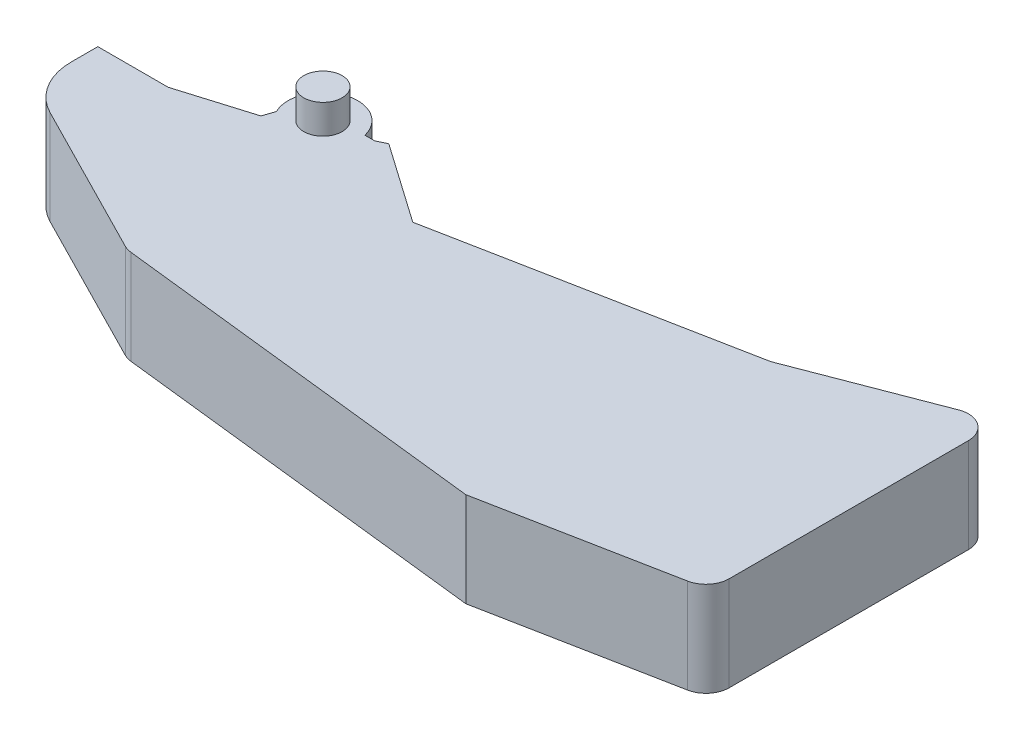
ISO-10303-21;
HEADER;
FILE_DESCRIPTION(('STEP AP214'),'2;1');
FILE_NAME('part.step','',(''),(''),'','','');
FILE_SCHEMA(('AUTOMOTIVE_DESIGN { 1 0 10303 214 1 1 1 1 }'));
ENDSEC;
DATA;
#1=APPLICATION_CONTEXT('core data for automotive mechanical design processes');
#2=APPLICATION_PROTOCOL_DEFINITION('international standard','automotive_design',2000,#1);
#3=PRODUCT_CONTEXT('',#1,'mechanical');
#4=PRODUCT('Part','Part','',(#3));
#5=PRODUCT_RELATED_PRODUCT_CATEGORY('part','',(#4));
#6=PRODUCT_DEFINITION_FORMATION('','',#4);
#7=PRODUCT_DEFINITION_CONTEXT('part definition',#1,'design');
#8=PRODUCT_DEFINITION('design','',#6,#7);
#9=PRODUCT_DEFINITION_SHAPE('','',#8);
#10=(LENGTH_UNIT() NAMED_UNIT(*) SI_UNIT(.MILLI.,.METRE.));
#11=(NAMED_UNIT(*) PLANE_ANGLE_UNIT() SI_UNIT($,.RADIAN.));
#12=(NAMED_UNIT(*) SI_UNIT($,.STERADIAN.) SOLID_ANGLE_UNIT());
#13=UNCERTAINTY_MEASURE_WITH_UNIT(LENGTH_MEASURE(1.E-05),#10,'distance_accuracy_value','');
#14=(GEOMETRIC_REPRESENTATION_CONTEXT(3) GLOBAL_UNCERTAINTY_ASSIGNED_CONTEXT((#13)) GLOBAL_UNIT_ASSIGNED_CONTEXT((#10,
#11,#12)) REPRESENTATION_CONTEXT('',''));
#15=CARTESIAN_POINT('',(0.,0.,0.));
#16=DIRECTION('',(0.,0.,1.));
#17=DIRECTION('',(1.,0.,0.));
#18=AXIS2_PLACEMENT_3D('',#15,#16,#17);
#19=CARTESIAN_POINT('',(43.8557588000729,-15.494,-32.9319911416841));
#20=DIRECTION('',(-0.358367949545299,0.,-0.933580426497202));
#21=DIRECTION('',(-0.933580426497202,0.,0.358367949545299));
#22=AXIS2_PLACEMENT_3D('',#19,#20,#21);
#23=PLANE('',#22);
#24=DIRECTION('',(0.,1.,0.));
#25=VECTOR('',#24,1.);
#26=CARTESIAN_POINT('',(52.4040091818142,-15.494,-36.2133570257123));
#27=LINE('',#26,#25);
#28=CARTESIAN_POINT('',(52.4040091818142,0.,-36.2133570257123));
#29=VERTEX_POINT('',#28);
#30=CARTESIAN_POINT('',(52.4040091818142,-15.494,-36.2133570257123));
#31=VERTEX_POINT('',#30);
#32=EDGE_CURVE('E473',#29,#31,#27,.F.);
#33=ORIENTED_EDGE('',*,*,#32,.T.);
#34=DIRECTION('',(-0.933580426497202,0.,0.3583679495453));
#35=VECTOR('',#34,1.);
#36=CARTESIAN_POINT('',(43.8557588000729,-15.494,-32.9319911416841));
#37=LINE('',#36,#35);
#38=CARTESIAN_POINT('',(30.1321265305642,-15.494,-27.6639822833682));
#39=VERTEX_POINT('',#38);
#40=EDGE_CURVE('E470',#31,#39,#37,.T.);
#41=ORIENTED_EDGE('',*,*,#40,.T.);
#42=DIRECTION('',(0.,1.,0.));
#43=VECTOR('',#42,1.);
#44=CARTESIAN_POINT('',(30.1321265305642,-15.494,-27.6639822833682));
#45=LINE('',#44,#43);
#46=CARTESIAN_POINT('',(30.1321265305642,0.,-27.6639822833682));
#47=VERTEX_POINT('',#46);
#48=EDGE_CURVE('E467',#39,#47,#45,.T.);
#49=ORIENTED_EDGE('',*,*,#48,.T.);
#50=DIRECTION('',(-0.933580426497202,0.,0.3583679495453));
#51=VECTOR('',#50,1.);
#52=CARTESIAN_POINT('',(43.8557588000729,0.,-32.9319911416841));
#53=LINE('',#52,#51);
#54=EDGE_CURVE('E463',#29,#47,#53,.T.);
#55=ORIENTED_EDGE('',*,*,#54,.F.);
#56=EDGE_LOOP('',(#33,#41,#49,#55));
#57=FACE_BOUND('',#56,.T.);
#58=ADVANCED_FACE('F53',(#57),#23,.T.);
#59=CARTESIAN_POINT('',(57.5793910695818,-15.494,-19.1));
#60=DIRECTION('',(1.,0.,0.));
#61=DIRECTION('',(0.,0.,-1.));
#62=AXIS2_PLACEMENT_3D('',#59,#60,#61);
#63=PLANE('',#62);
#64=DIRECTION('',(0.,1.,0.));
#65=VECTOR('',#64,1.);
#66=CARTESIAN_POINT('',(57.5793910695818,-15.494,6.58405752319649));
#67=LINE('',#66,#65);
#68=CARTESIAN_POINT('',(57.5793910695818,0.,6.58405752319649));
#69=VERTEX_POINT('',#68);
#70=CARTESIAN_POINT('',(57.5793910695818,-15.494,6.58405752319649));
#71=VERTEX_POINT('',#70);
#72=EDGE_CURVE('E460',#69,#71,#67,.F.);
#73=ORIENTED_EDGE('',*,*,#72,.T.);
#74=DIRECTION('',(0.,0.,-1.));
#75=VECTOR('',#74,1.);
#76=CARTESIAN_POINT('',(57.5793910695818,-15.494,-19.1));
#77=LINE('',#76,#75);
#78=CARTESIAN_POINT('',(57.5793910695818,-15.494,-32.656415600758));
#79=VERTEX_POINT('',#78);
#80=EDGE_CURVE('E457',#71,#79,#77,.T.);
#81=ORIENTED_EDGE('',*,*,#80,.T.);
#82=DIRECTION('',(0.,1.,0.));
#83=VECTOR('',#82,1.);
#84=CARTESIAN_POINT('',(57.5793910695818,-15.494,-32.656415600758));
#85=LINE('',#84,#83);
#86=CARTESIAN_POINT('',(57.5793910695818,0.,-32.656415600758));
#87=VERTEX_POINT('',#86);
#88=EDGE_CURVE('E454',#79,#87,#85,.T.);
#89=ORIENTED_EDGE('',*,*,#88,.T.);
#90=DIRECTION('',(0.,0.,-1.));
#91=VECTOR('',#90,1.);
#92=CARTESIAN_POINT('',(57.5793910695818,0.,-19.1));
#93=LINE('',#92,#91);
#94=EDGE_CURVE('E450',#69,#87,#93,.T.);
#95=ORIENTED_EDGE('',*,*,#94,.F.);
#96=EDGE_LOOP('',(#73,#81,#89,#95));
#97=FACE_BOUND('',#96,.T.);
#98=ADVANCED_FACE('F530',(#97),#63,.T.);
#99=CARTESIAN_POINT('',(40.809422082398,-15.494,12.9845309091199));
#100=DIRECTION('',(0.190808995376544,0.,0.981627183447664));
#101=DIRECTION('',(0.981627183447664,0.,-0.190808995376544));
#102=AXIS2_PLACEMENT_3D('',#99,#100,#101);
#103=PLANE('',#102);
#104=DIRECTION('',(0.,1.,0.));
#105=VECTOR('',#104,1.);
#106=CARTESIAN_POINT('',(24.0394530952143,-15.494,16.2442826650786));
#107=LINE('',#106,#105);
#108=CARTESIAN_POINT('',(24.0394530952143,-15.494,16.2442826650786));
#109=VERTEX_POINT('',#108);
#110=CARTESIAN_POINT('',(24.0394530952143,0.,16.2442826650786));
#111=VERTEX_POINT('',#110);
#112=EDGE_CURVE('E446',#109,#111,#107,.T.);
#113=ORIENTED_EDGE('',*,*,#112,.F.);
#114=DIRECTION('',(0.981627183447664,0.,-0.190808995376544));
#115=VECTOR('',#114,1.);
#116=CARTESIAN_POINT('',(40.809422082398,-15.494,12.9845309091199));
#117=LINE('',#116,#115);
#118=CARTESIAN_POINT('',(54.4963733419664,-15.494,10.3240570921321));
#119=VERTEX_POINT('',#118);
#120=EDGE_CURVE('E443',#109,#119,#117,.T.);
#121=ORIENTED_EDGE('',*,*,#120,.T.);
#122=DIRECTION('',(0.,1.,0.));
#123=VECTOR('',#122,1.);
#124=CARTESIAN_POINT('',(54.4963733419664,-15.494,10.3240570921321));
#125=LINE('',#124,#123);
#126=CARTESIAN_POINT('',(54.4963733419664,0.,10.3240570921321));
#127=VERTEX_POINT('',#126);
#128=EDGE_CURVE('E440',#119,#127,#125,.T.);
#129=ORIENTED_EDGE('',*,*,#128,.T.);
#130=DIRECTION('',(0.981627183447664,0.,-0.190808995376544));
#131=VECTOR('',#130,1.);
#132=CARTESIAN_POINT('',(40.809422082398,0.,12.9845309091199));
#133=LINE('',#132,#131);
#134=EDGE_CURVE('E436',#111,#127,#133,.T.);
#135=ORIENTED_EDGE('',*,*,#134,.F.);
#136=EDGE_LOOP('',(#113,#121,#129,#135));
#137=FACE_BOUND('',#136,.T.);
#138=ADVANCED_FACE('F535',(#137),#103,.T.);
#139=CARTESIAN_POINT('',(-23.0988407655279,-15.494,10.9390331126197));
#140=DIRECTION('',(-0.111840394594806,0.,0.993726182676535));
#141=DIRECTION('',(0.993726182676535,0.,0.111840394594806));
#142=AXIS2_PLACEMENT_3D('',#139,#140,#141);
#143=PLANE('',#142);
#144=DIRECTION('',(0.,1.,0.));
#145=VECTOR('',#144,1.);
#146=CARTESIAN_POINT('',(-37.8654554184542,-15.494,9.27710245364836));
#147=LINE('',#146,#145);
#148=CARTESIAN_POINT('',(-37.8654554184542,0.,9.27710245364836));
#149=VERTEX_POINT('',#148);
#150=CARTESIAN_POINT('',(-37.8654554184542,-15.494,9.27710245364836));
#151=VERTEX_POINT('',#150);
#152=EDGE_CURVE('E433',#149,#151,#147,.F.);
#153=ORIENTED_EDGE('',*,*,#152,.T.);
#154=DIRECTION('',(0.993726182676535,0.,0.111840394594806));
#155=VECTOR('',#154,1.);
#156=CARTESIAN_POINT('',(-23.0988407655279,-15.494,10.9390331126197));
#157=LINE('',#156,#155);
#158=EDGE_CURVE('E429',#151,#109,#157,.T.);
#159=ORIENTED_EDGE('',*,*,#158,.T.);
#160=ORIENTED_EDGE('',*,*,#112,.T.);
#161=DIRECTION('',(0.993726182676535,0.,0.111840394594806));
#162=VECTOR('',#161,1.);
#163=CARTESIAN_POINT('',(-23.0988407655279,0.,10.9390331126197));
#164=LINE('',#163,#162);
#165=EDGE_CURVE('E425',#149,#111,#164,.T.);
#166=ORIENTED_EDGE('',*,*,#165,.F.);
#167=EDGE_LOOP('',(#153,#159,#160,#166));
#168=FACE_BOUND('',#167,.T.);
#169=ADVANCED_FACE('F541',(#168),#143,.T.);
#170=CARTESIAN_POINT('',(-54.1689812200517,-15.494,1.24289249151677));
#171=DIRECTION('',(-0.453990499739547,0.,0.891006524188368));
#172=DIRECTION('',(0.891006524188368,0.,0.453990499739547));
#173=AXIS2_PLACEMENT_3D('',#170,#171,#172);
#174=PLANE('',#173);
#175=DIRECTION('',(0.891006524188368,0.,0.453990499739547));
#176=VECTOR('',#175,1.);
#177=CARTESIAN_POINT('',(-54.1689812200517,0.,1.24289249151677));
#178=LINE('',#177,#176);
#179=CARTESIAN_POINT('',(-64.3250925925634,0.,-3.93190472067773));
#180=VERTEX_POINT('',#179);
#181=CARTESIAN_POINT('',(-39.1690473190557,0.,8.88574055480845));
#182=VERTEX_POINT('',#181);
#183=EDGE_CURVE('E415',#180,#182,#178,.T.);
#184=ORIENTED_EDGE('',*,*,#183,.F.);
#185=DIRECTION('',(0.,1.,0.));
#186=VECTOR('',#185,1.);
#187=CARTESIAN_POINT('',(-64.3250925925634,-15.494,-3.93190472067773));
#188=LINE('',#187,#186);
#189=CARTESIAN_POINT('',(-64.3250925925634,-15.494,-3.93190472067773));
#190=VERTEX_POINT('',#189);
#191=EDGE_CURVE('E62',#180,#190,#188,.F.);
#192=ORIENTED_EDGE('',*,*,#191,.T.);
#193=DIRECTION('',(0.891006524188368,0.,0.453990499739547));
#194=VECTOR('',#193,1.);
#195=CARTESIAN_POINT('',(-54.1689812200517,-15.494,1.24289249151677));
#196=LINE('',#195,#194);
#197=CARTESIAN_POINT('',(-39.1690473190557,-15.494,8.88574055480845));
#198=VERTEX_POINT('',#197);
#199=EDGE_CURVE('E422',#190,#198,#196,.T.);
#200=ORIENTED_EDGE('',*,*,#199,.T.);
#201=DIRECTION('',(0.,1.,0.));
#202=VECTOR('',#201,1.);
#203=CARTESIAN_POINT('',(-39.1690473190557,-15.494,8.88574055480845));
#204=LINE('',#203,#202);
#205=EDGE_CURVE('E418',#198,#182,#204,.T.);
#206=ORIENTED_EDGE('',*,*,#205,.T.);
#207=EDGE_LOOP('',(#184,#192,#200,#206));
#208=FACE_BOUND('',#207,.T.);
#209=ADVANCED_FACE('F545',(#208),#174,.T.);
#210=CARTESIAN_POINT('',(-69.7851875951679,-15.494,-11.9671071016602));
#211=DIRECTION('',(-1.,0.,0.));
#212=DIRECTION('',(0.,0.,1.));
#213=AXIS2_PLACEMENT_3D('',#210,#211,#212);
#214=PLANE('',#213);
#215=DIRECTION('',(0.,0.,1.));
#216=VECTOR('',#215,1.);
#217=CARTESIAN_POINT('',(-69.7851875951679,-15.494,-11.9671071016602));
#218=LINE('',#217,#216);
#219=CARTESIAN_POINT('',(-69.7851875951679,-15.494,-17.2202521221583));
#220=VERTEX_POINT('',#219);
#221=CARTESIAN_POINT('',(-69.7851875951679,-15.494,-12.8419699625614));
#222=VERTEX_POINT('',#221);
#223=EDGE_CURVE('E407',#220,#222,#218,.T.);
#224=ORIENTED_EDGE('',*,*,#223,.T.);
#225=DIRECTION('',(0.,1.,0.));
#226=VECTOR('',#225,1.);
#227=CARTESIAN_POINT('',(-69.7851875951679,-15.494,-12.8419699625614));
#228=LINE('',#227,#226);
#229=CARTESIAN_POINT('',(-69.7851875951679,0.,-12.8419699625614));
#230=VERTEX_POINT('',#229);
#231=EDGE_CURVE('E476',#222,#230,#228,.T.);
#232=ORIENTED_EDGE('',*,*,#231,.T.);
#233=DIRECTION('',(0.,0.,1.));
#234=VECTOR('',#233,1.);
#235=CARTESIAN_POINT('',(-69.7851875951679,0.,-11.9671071016602));
#236=LINE('',#235,#234);
#237=CARTESIAN_POINT('',(-69.7851875951679,0.,-17.2202521221583));
#238=VERTEX_POINT('',#237);
#239=EDGE_CURVE('E404',#238,#230,#236,.T.);
#240=ORIENTED_EDGE('',*,*,#239,.F.);
#241=DIRECTION('',(0.,1.,0.));
#242=VECTOR('',#241,1.);
#243=CARTESIAN_POINT('',(-69.7851875951679,-15.494,-17.2202521221583));
#244=LINE('',#243,#242);
#245=CARTESIAN_POINT('',(-69.7851875951679,-2.4137702714423,-17.2202521221583));
#246=VERTEX_POINT('',#245);
#247=EDGE_CURVE('E403',#246,#238,#244,.T.);
#248=ORIENTED_EDGE('',*,*,#247,.F.);
#249=DIRECTION('',(0.,0.,-1.));
#250=VECTOR('',#249,1.);
#251=CARTESIAN_POINT('',(-69.7851875951679,-2.4137702714423,-11.9671071016602));
#252=LINE('',#251,#250);
#253=CARTESIAN_POINT('',(-69.7851875951679,-2.4137702714423,-16.2042521221583));
#254=VERTEX_POINT('',#253);
#255=EDGE_CURVE('E399',#254,#246,#252,.T.);
#256=ORIENTED_EDGE('',*,*,#255,.F.);
#257=DIRECTION('',(0.,-1.,0.));
#258=VECTOR('',#257,1.);
#259=CARTESIAN_POINT('',(-69.7851875951679,-15.494,-16.2042521221583));
#260=LINE('',#259,#258);
#261=CARTESIAN_POINT('',(-69.7851875951679,-12.8277702714423,-16.2042521221583));
#262=VERTEX_POINT('',#261);
#263=EDGE_CURVE('E396',#254,#262,#260,.T.);
#264=ORIENTED_EDGE('',*,*,#263,.T.);
#265=DIRECTION('',(0.,0.,1.));
#266=VECTOR('',#265,1.);
#267=CARTESIAN_POINT('',(-69.7851875951679,-12.8277702714423,-11.9671071016602));
#268=LINE('',#267,#266);
#269=CARTESIAN_POINT('',(-69.7851875951679,-12.8277702714423,-17.2202521221583));
#270=VERTEX_POINT('',#269);
#271=EDGE_CURVE('E393',#270,#262,#268,.T.);
#272=ORIENTED_EDGE('',*,*,#271,.F.);
#273=EDGE_CURVE('E411',#220,#270,#244,.T.);
#274=ORIENTED_EDGE('',*,*,#273,.F.);
#275=EDGE_LOOP('',(#224,#232,#240,#248,#256,#264,#272,#274));
#276=FACE_BOUND('',#275,.T.);
#277=ADVANCED_FACE('F497',(#276),#214,.T.);
#278=CARTESIAN_POINT('',(-40.8221068625392,-15.494,-25.1820473738689));
#279=DIRECTION('',(0.,1.,0.));
#280=DIRECTION('',(0.,0.,1.));
#281=AXIS2_PLACEMENT_3D('',#278,#279,#280);
#282=CYLINDRICAL_SURFACE('',#281,5.69049014174114);
#283=CARTESIAN_POINT('',(-40.8221068625392,-15.494,-25.1820473738689));
#284=DIRECTION('',(0.,-1.,0.));
#285=DIRECTION('',(0.,0.,-1.));
#286=AXIS2_PLACEMENT_3D('',#283,#284,#285);
#287=CIRCLE('',#286,5.69049014174114);
#288=CARTESIAN_POINT('',(-45.9175512473654,-15.494,-22.6486455947593));
#289=VERTEX_POINT('',#288);
#290=CARTESIAN_POINT('',(-35.2972195374979,-15.494,-26.5448746185521));
#291=VERTEX_POINT('',#290);
#292=EDGE_CURVE('E389',#289,#291,#287,.T.);
#293=ORIENTED_EDGE('',*,*,#292,.F.);
#294=DIRECTION('',(0.,1.,0.));
#295=VECTOR('',#294,1.);
#296=CARTESIAN_POINT('',(-45.9175512473654,-15.494,-22.6486455947593));
#297=LINE('',#296,#295);
#298=CARTESIAN_POINT('',(-45.9175512473654,0.,-22.6486455947593));
#299=VERTEX_POINT('',#298);
#300=EDGE_CURVE('E386',#289,#299,#297,.T.);
#301=ORIENTED_EDGE('',*,*,#300,.T.);
#302=CARTESIAN_POINT('',(-40.8221068625392,0.,-25.1820473738689));
#303=DIRECTION('',(0.,-1.,0.));
#304=DIRECTION('',(0.,0.,-1.));
#305=AXIS2_PLACEMENT_3D('',#302,#303,#304);
#306=CIRCLE('',#305,5.69049014174114);
#307=CARTESIAN_POINT('',(-35.2972195374979,0.,-26.5448746185521));
#308=VERTEX_POINT('',#307);
#309=EDGE_CURVE('E383',#299,#308,#306,.T.);
#310=ORIENTED_EDGE('',*,*,#309,.T.);
#311=DIRECTION('',(0.,1.,0.));
#312=VECTOR('',#311,1.);
#313=CARTESIAN_POINT('',(-35.2972195374979,-15.494,-26.5448746185521));
#314=LINE('',#313,#312);
#315=EDGE_CURVE('E379',#291,#308,#314,.T.);
#316=ORIENTED_EDGE('',*,*,#315,.F.);
#317=EDGE_LOOP('',(#293,#301,#310,#316));
#318=FACE_BOUND('',#317,.T.);
#319=ADVANCED_FACE('F551',(#318),#282,.T.);
#320=CARTESIAN_POINT('',(-37.4393435150481,-15.494,5.49100569765077));
#321=DIRECTION('',(0.,1.,0.));
#322=DIRECTION('',(0.,0.,1.));
#323=AXIS2_PLACEMENT_3D('',#320,#321,#322);
#324=CYLINDRICAL_SURFACE('',#323,3.81);
#325=ORIENTED_EDGE('',*,*,#205,.F.);
#326=CARTESIAN_POINT('',(-37.4393435150481,-15.494,5.49100569765077));
#327=DIRECTION('',(0.,-1.,0.));
#328=DIRECTION('',(0.,0.,-1.));
#329=AXIS2_PLACEMENT_3D('',#326,#327,#328);
#330=CIRCLE('',#329,3.81);
#331=EDGE_CURVE('E375',#198,#151,#330,.F.);
#332=ORIENTED_EDGE('',*,*,#331,.T.);
#333=ORIENTED_EDGE('',*,*,#152,.F.);
#334=CARTESIAN_POINT('',(-37.4393435150481,0.,5.49100569765077));
#335=DIRECTION('',(0.,-1.,0.));
#336=DIRECTION('',(0.,0.,-1.));
#337=AXIS2_PLACEMENT_3D('',#334,#335,#336);
#338=CIRCLE('',#337,3.81);
#339=EDGE_CURVE('E371',#182,#149,#338,.F.);
#340=ORIENTED_EDGE('',*,*,#339,.F.);
#341=EDGE_LOOP('',(#325,#332,#333,#340));
#342=FACE_BOUND('',#341,.T.);
#343=ADVANCED_FACE('F554',(#342),#324,.T.);
#344=CARTESIAN_POINT('',(53.7693910695818,-15.494,6.58405752319649));
#345=DIRECTION('',(0.,1.,0.));
#346=DIRECTION('',(0.,0.,1.));
#347=AXIS2_PLACEMENT_3D('',#344,#345,#346);
#348=CYLINDRICAL_SURFACE('',#347,3.81);
#349=ORIENTED_EDGE('',*,*,#128,.F.);
#350=CARTESIAN_POINT('',(53.7693910695818,-15.494,6.58405752319649));
#351=DIRECTION('',(0.,-1.,0.));
#352=DIRECTION('',(0.,0.,-1.));
#353=AXIS2_PLACEMENT_3D('',#350,#351,#352);
#354=CIRCLE('',#353,3.81);
#355=EDGE_CURVE('E367',#119,#71,#354,.F.);
#356=ORIENTED_EDGE('',*,*,#355,.T.);
#357=ORIENTED_EDGE('',*,*,#72,.F.);
#358=CARTESIAN_POINT('',(53.7693910695818,0.,6.58405752319649));
#359=DIRECTION('',(0.,-1.,0.));
#360=DIRECTION('',(0.,0.,-1.));
#361=AXIS2_PLACEMENT_3D('',#358,#359,#360);
#362=CIRCLE('',#361,3.81);
#363=EDGE_CURVE('E363',#127,#69,#362,.F.);
#364=ORIENTED_EDGE('',*,*,#363,.F.);
#365=EDGE_LOOP('',(#349,#356,#357,#364));
#366=FACE_BOUND('',#365,.T.);
#367=ADVANCED_FACE('F558',(#366),#348,.T.);
#368=CARTESIAN_POINT('',(53.7693910695818,-15.494,-32.656415600758));
#369=DIRECTION('',(0.,1.,0.));
#370=DIRECTION('',(0.,0.,1.));
#371=AXIS2_PLACEMENT_3D('',#368,#369,#370);
#372=CYLINDRICAL_SURFACE('',#371,3.81);
#373=ORIENTED_EDGE('',*,*,#88,.F.);
#374=CARTESIAN_POINT('',(53.7693910695818,-15.494,-32.656415600758));
#375=DIRECTION('',(0.,-1.,0.));
#376=DIRECTION('',(0.,0.,-1.));
#377=AXIS2_PLACEMENT_3D('',#374,#375,#376);
#378=CIRCLE('',#377,3.81);
#379=EDGE_CURVE('E359',#79,#31,#378,.F.);
#380=ORIENTED_EDGE('',*,*,#379,.T.);
#381=ORIENTED_EDGE('',*,*,#32,.F.);
#382=CARTESIAN_POINT('',(53.7693910695818,0.,-32.656415600758));
#383=DIRECTION('',(0.,-1.,0.));
#384=DIRECTION('',(0.,0.,-1.));
#385=AXIS2_PLACEMENT_3D('',#382,#383,#384);
#386=CIRCLE('',#385,3.81);
#387=EDGE_CURVE('E355',#87,#29,#386,.F.);
#388=ORIENTED_EDGE('',*,*,#387,.F.);
#389=EDGE_LOOP('',(#373,#380,#381,#388));
#390=FACE_BOUND('',#389,.T.);
#391=ADVANCED_FACE('F562',(#390),#372,.T.);
#392=CARTESIAN_POINT('',(-61.2424166205108,-15.494,-17.2202521221583));
#393=DIRECTION('',(0.,0.,1.));
#394=DIRECTION('',(1.,0.,0.));
#395=AXIS2_PLACEMENT_3D('',#392,#393,#394);
#396=PLANE('',#395);
#397=DIRECTION('',(0.,1.,0.));
#398=VECTOR('',#397,1.);
#399=CARTESIAN_POINT('',(-58.2424166205108,-15.494,-17.2202521221583));
#400=LINE('',#399,#398);
#401=CARTESIAN_POINT('',(-58.2424166205108,-15.494,-17.2202521221583));
#402=VERTEX_POINT('',#401);
#403=CARTESIAN_POINT('',(-58.2424166205108,0.,-17.2202521221583));
#404=VERTEX_POINT('',#403);
#405=EDGE_CURVE('E351',#402,#404,#400,.T.);
#406=ORIENTED_EDGE('',*,*,#405,.F.);
#407=DIRECTION('',(1.,0.,0.));
#408=VECTOR('',#407,1.);
#409=CARTESIAN_POINT('',(-61.2424166205108,-15.494,-17.2202521221583));
#410=LINE('',#409,#408);
#411=EDGE_CURVE('E347',#220,#402,#410,.T.);
#412=ORIENTED_EDGE('',*,*,#411,.F.);
#413=ORIENTED_EDGE('',*,*,#273,.T.);
#414=DIRECTION('',(-1.,0.,0.));
#415=VECTOR('',#414,1.);
#416=CARTESIAN_POINT('',(-67.6658166205107,-12.8277702714423,-17.2202521221583));
#417=LINE('',#416,#415);
#418=CARTESIAN_POINT('',(-61.6714166205108,-12.8277702714423,-17.2202521221583));
#419=VERTEX_POINT('',#418);
#420=EDGE_CURVE('E343',#419,#270,#417,.T.);
#421=ORIENTED_EDGE('',*,*,#420,.F.);
#422=DIRECTION('',(0.,1.,0.));
#423=VECTOR('',#422,1.);
#424=CARTESIAN_POINT('',(-61.6714166205108,-7.6207702714423,-17.2202521221583));
#425=LINE('',#424,#423);
#426=CARTESIAN_POINT('',(-61.6714166205108,-2.4137702714423,-17.2202521221583));
#427=VERTEX_POINT('',#426);
#428=EDGE_CURVE('E340',#419,#427,#425,.T.);
#429=ORIENTED_EDGE('',*,*,#428,.T.);
#430=DIRECTION('',(1.,0.,0.));
#431=VECTOR('',#430,1.);
#432=CARTESIAN_POINT('',(-67.6658166205107,-2.4137702714423,-17.2202521221583));
#433=LINE('',#432,#431);
#434=EDGE_CURVE('E336',#246,#427,#433,.T.);
#435=ORIENTED_EDGE('',*,*,#434,.F.);
#436=ORIENTED_EDGE('',*,*,#247,.T.);
#437=DIRECTION('',(1.,0.,0.));
#438=VECTOR('',#437,1.);
#439=CARTESIAN_POINT('',(-61.2424166205108,0.,-17.2202521221583));
#440=LINE('',#439,#438);
#441=EDGE_CURVE('E333',#238,#404,#440,.T.);
#442=ORIENTED_EDGE('',*,*,#441,.T.);
#443=EDGE_LOOP('',(#406,#412,#413,#421,#429,#435,#436,#442));
#444=FACE_BOUND('',#443,.T.);
#445=ADVANCED_FACE('F486',(#444),#396,.F.);
#446=CARTESIAN_POINT('',(-53.2601353905734,-15.494,-18.7265385311171));
#447=DIRECTION('',(0.289392201529061,0.,0.957210610938974));
#448=DIRECTION('',(0.957210610938974,0.,-0.289392201529061));
#449=AXIS2_PLACEMENT_3D('',#446,#447,#448);
#450=PLANE('',#449);
#451=DIRECTION('',(0.,1.,0.));
#452=VECTOR('',#451,1.);
#453=CARTESIAN_POINT('',(-46.5661832017515,-15.494,-20.7503121277691));
#454=LINE('',#453,#452);
#455=CARTESIAN_POINT('',(-46.5661832017515,-15.494,-20.7503121277691));
#456=VERTEX_POINT('',#455);
#457=CARTESIAN_POINT('',(-46.5661832017515,0.,-20.7503121277691));
#458=VERTEX_POINT('',#457);
#459=EDGE_CURVE('E329',#456,#458,#454,.T.);
#460=ORIENTED_EDGE('',*,*,#459,.F.);
#461=DIRECTION('',(0.957210610938974,0.,-0.289392201529061));
#462=VECTOR('',#461,1.);
#463=CARTESIAN_POINT('',(-53.2601353905734,-15.494,-18.7265385311171));
#464=LINE('',#463,#462);
#465=EDGE_CURVE('E325',#402,#456,#464,.T.);
#466=ORIENTED_EDGE('',*,*,#465,.F.);
#467=ORIENTED_EDGE('',*,*,#405,.T.);
#468=DIRECTION('',(0.957210610938974,0.,-0.289392201529061));
#469=VECTOR('',#468,1.);
#470=CARTESIAN_POINT('',(-53.2601353905734,0.,-18.7265385311171));
#471=LINE('',#470,#469);
#472=EDGE_CURVE('E322',#404,#458,#471,.T.);
#473=ORIENTED_EDGE('',*,*,#472,.T.);
#474=EDGE_LOOP('',(#460,#466,#467,#473));
#475=FACE_BOUND('',#474,.T.);
#476=ADVANCED_FACE('F504',(#475),#450,.F.);
#477=CARTESIAN_POINT('',(-46.2418672245585,-15.494,-21.6994788612642));
#478=DIRECTION('',(0.946285732592842,0.,0.323331582576196));
#479=DIRECTION('',(0.323331582576196,0.,-0.946285732592842));
#480=AXIS2_PLACEMENT_3D('',#477,#478,#479);
#481=PLANE('',#480);
#482=ORIENTED_EDGE('',*,*,#300,.F.);
#483=DIRECTION('',(0.323331582576197,0.,-0.946285732592842));
#484=VECTOR('',#483,1.);
#485=CARTESIAN_POINT('',(-46.2418672245585,-15.494,-21.6994788612642));
#486=LINE('',#485,#484);
#487=EDGE_CURVE('E318',#456,#289,#486,.T.);
#488=ORIENTED_EDGE('',*,*,#487,.F.);
#489=ORIENTED_EDGE('',*,*,#459,.T.);
#490=DIRECTION('',(0.323331582576197,0.,-0.946285732592842));
#491=VECTOR('',#490,1.);
#492=CARTESIAN_POINT('',(-46.2418672245585,0.,-21.6994788612642));
#493=LINE('',#492,#491);
#494=EDGE_CURVE('E314',#458,#299,#493,.T.);
#495=ORIENTED_EDGE('',*,*,#494,.T.);
#496=EDGE_LOOP('',(#482,#488,#489,#495));
#497=FACE_BOUND('',#496,.T.);
#498=ADVANCED_FACE('F509',(#497),#481,.F.);
#499=CARTESIAN_POINT('',(-34.4967503403147,-15.494,-26.5448746185521));
#500=DIRECTION('',(0.,0.,-1.));
#501=DIRECTION('',(-1.,0.,0.));
#502=AXIS2_PLACEMENT_3D('',#499,#500,#501);
#503=PLANE('',#502);
#504=DIRECTION('',(-1.,0.,0.));
#505=VECTOR('',#504,1.);
#506=CARTESIAN_POINT('',(-34.4967503403147,-15.494,-26.5448746185521));
#507=LINE('',#506,#505);
#508=CARTESIAN_POINT('',(-33.6962811431316,-15.494,-26.5448746185521));
#509=VERTEX_POINT('',#508);
#510=EDGE_CURVE('E310',#509,#291,#507,.T.);
#511=ORIENTED_EDGE('',*,*,#510,.T.);
#512=ORIENTED_EDGE('',*,*,#315,.T.);
#513=DIRECTION('',(-1.,0.,0.));
#514=VECTOR('',#513,1.);
#515=CARTESIAN_POINT('',(-34.4967503403147,0.,-26.5448746185521));
#516=LINE('',#515,#514);
#517=CARTESIAN_POINT('',(-33.6962811431316,0.,-26.5448746185521));
#518=VERTEX_POINT('',#517);
#519=EDGE_CURVE('E306',#518,#308,#516,.T.);
#520=ORIENTED_EDGE('',*,*,#519,.F.);
#521=DIRECTION('',(0.,1.,0.));
#522=VECTOR('',#521,1.);
#523=CARTESIAN_POINT('',(-33.6962811431316,-15.494,-26.5448746185521));
#524=LINE('',#523,#522);
#525=EDGE_CURVE('E302',#509,#518,#524,.T.);
#526=ORIENTED_EDGE('',*,*,#525,.F.);
#527=EDGE_LOOP('',(#511,#512,#520,#526));
#528=FACE_BOUND('',#527,.T.);
#529=ADVANCED_FACE('F573',(#528),#503,.T.);
#530=CARTESIAN_POINT('',(-32.910330198208,-15.494,-26.9161367425167));
#531=DIRECTION('',(-0.427117887924654,0.,-0.904195946581703));
#532=DIRECTION('',(-0.904195946581703,0.,0.427117887924654));
#533=AXIS2_PLACEMENT_3D('',#530,#531,#532);
#534=PLANE('',#533);
#535=DIRECTION('',(-0.904195946581703,0.,0.427117887924655));
#536=VECTOR('',#535,1.);
#537=CARTESIAN_POINT('',(-32.910330198208,-15.494,-26.9161367425167));
#538=LINE('',#537,#536);
#539=CARTESIAN_POINT('',(-32.1243792532844,-15.494,-27.2873988664814));
#540=VERTEX_POINT('',#539);
#541=EDGE_CURVE('E298',#540,#509,#538,.T.);
#542=ORIENTED_EDGE('',*,*,#541,.T.);
#543=ORIENTED_EDGE('',*,*,#525,.T.);
#544=DIRECTION('',(-0.904195946581703,0.,0.427117887924655));
#545=VECTOR('',#544,1.);
#546=CARTESIAN_POINT('',(-32.910330198208,0.,-26.9161367425167));
#547=LINE('',#546,#545);
#548=CARTESIAN_POINT('',(-32.1243792532844,0.,-27.2873988664814));
#549=VERTEX_POINT('',#548);
#550=EDGE_CURVE('E294',#549,#518,#547,.T.);
#551=ORIENTED_EDGE('',*,*,#550,.F.);
#552=DIRECTION('',(0.,1.,0.));
#553=VECTOR('',#552,1.);
#554=CARTESIAN_POINT('',(-32.1243792532844,-15.494,-27.2873988664814));
#555=LINE('',#554,#553);
#556=EDGE_CURVE('E290',#540,#549,#555,.T.);
#557=ORIENTED_EDGE('',*,*,#556,.F.);
#558=EDGE_LOOP('',(#542,#543,#551,#557));
#559=FACE_BOUND('',#558,.T.);
#560=ADVANCED_FACE('F576',(#559),#534,.T.);
#561=CARTESIAN_POINT('',(-25.5711628989724,-15.494,-22.698787375673));
#562=DIRECTION('',(-0.573576436351047,0.,0.819152044288991));
#563=DIRECTION('',(0.819152044288992,0.,0.573576436351047));
#564=AXIS2_PLACEMENT_3D('',#561,#562,#563);
#565=PLANE('',#564);
#566=DIRECTION('',(0.,1.,0.));
#567=VECTOR('',#566,1.);
#568=CARTESIAN_POINT('',(-19.0179465446605,-15.494,-18.1101758848646));
#569=LINE('',#568,#567);
#570=CARTESIAN_POINT('',(-19.0179465446605,-15.494,-18.1101758848646));
#571=VERTEX_POINT('',#570);
#572=CARTESIAN_POINT('',(-19.0179465446605,0.,-18.1101758848646));
#573=VERTEX_POINT('',#572);
#574=EDGE_CURVE('E286',#571,#573,#569,.T.);
#575=ORIENTED_EDGE('',*,*,#574,.F.);
#576=DIRECTION('',(0.819152044288991,0.,0.573576436351047));
#577=VECTOR('',#576,1.);
#578=CARTESIAN_POINT('',(-25.5711628989724,-15.494,-22.698787375673));
#579=LINE('',#578,#577);
#580=EDGE_CURVE('E282',#540,#571,#579,.T.);
#581=ORIENTED_EDGE('',*,*,#580,.F.);
#582=ORIENTED_EDGE('',*,*,#556,.T.);
#583=DIRECTION('',(0.819152044288991,0.,0.573576436351047));
#584=VECTOR('',#583,1.);
#585=CARTESIAN_POINT('',(-25.5711628989724,0.,-22.698787375673));
#586=LINE('',#585,#584);
#587=EDGE_CURVE('E279',#549,#573,#586,.T.);
#588=ORIENTED_EDGE('',*,*,#587,.T.);
#589=EDGE_LOOP('',(#575,#581,#582,#588));
#590=FACE_BOUND('',#589,.T.);
#591=ADVANCED_FACE('F580',(#590),#565,.F.);
#592=CARTESIAN_POINT('',(-17.1140608605828,-15.494,-18.4802537726985));
#593=DIRECTION('',(-0.190808995376544,0.,-0.981627183447664));
#594=DIRECTION('',(-0.981627183447664,0.,0.190808995376544));
#595=AXIS2_PLACEMENT_3D('',#592,#593,#594);
#596=PLANE('',#595);
#597=DIRECTION('',(-0.981627183447664,0.,0.190808995376545));
#598=VECTOR('',#597,1.);
#599=CARTESIAN_POINT('',(-17.1140608605828,-15.494,-18.4802537726985));
#600=LINE('',#599,#598);
#601=EDGE_CURVE('E275',#39,#571,#600,.T.);
#602=ORIENTED_EDGE('',*,*,#601,.T.);
#603=ORIENTED_EDGE('',*,*,#574,.T.);
#604=DIRECTION('',(-0.981627183447664,0.,0.190808995376545));
#605=VECTOR('',#604,1.);
#606=CARTESIAN_POINT('',(-17.1140608605828,0.,-18.4802537726985));
#607=LINE('',#606,#605);
#608=EDGE_CURVE('E271',#47,#573,#607,.T.);
#609=ORIENTED_EDGE('',*,*,#608,.F.);
#610=ORIENTED_EDGE('',*,*,#48,.F.);
#611=EDGE_LOOP('',(#602,#603,#609,#610));
#612=FACE_BOUND('',#611,.T.);
#613=ADVANCED_FACE('F584',(#612),#596,.T.);
#614=CARTESIAN_POINT('',(11.0317043995232,0.,-7.78572622342056));
#615=DIRECTION('',(0.,-1.,0.));
#616=DIRECTION('',(1.,0.,0.));
#617=AXIS2_PLACEMENT_3D('',#614,#615,#616);
#618=PLANE('',#617);
#619=CARTESIAN_POINT('',(-40.8221068625392,0.,-25.1820473738689));
#620=DIRECTION('',(0.,1.,0.));
#621=DIRECTION('',(0.,0.,1.));
#622=AXIS2_PLACEMENT_3D('',#619,#620,#621);
#623=CIRCLE('',#622,3.15049014174115);
#624=CARTESIAN_POINT('',(-40.8221068625392,0.,-22.0315572321278));
#625=VERTEX_POINT('',#624);
#626=EDGE_CURVE('E267',#625,#625,#623,.T.);
#627=ORIENTED_EDGE('',*,*,#626,.F.);
#628=EDGE_LOOP('',(#627));
#629=FACE_BOUND('',#628,.T.);
#630=ORIENTED_EDGE('',*,*,#239,.T.);
#631=CARTESIAN_POINT('',(-59.7851875951679,0.,-12.8419699625614));
#632=DIRECTION('',(0.,-1.,0.));
#633=DIRECTION('',(0.,0.,-1.));
#634=AXIS2_PLACEMENT_3D('',#631,#632,#633);
#635=CIRCLE('',#634,10.);
#636=EDGE_CURVE('E76',#230,#180,#635,.F.);
#637=ORIENTED_EDGE('',*,*,#636,.T.);
#638=ORIENTED_EDGE('',*,*,#183,.T.);
#639=ORIENTED_EDGE('',*,*,#339,.T.);
#640=ORIENTED_EDGE('',*,*,#165,.T.);
#641=ORIENTED_EDGE('',*,*,#134,.T.);
#642=ORIENTED_EDGE('',*,*,#363,.T.);
#643=ORIENTED_EDGE('',*,*,#94,.T.);
#644=ORIENTED_EDGE('',*,*,#387,.T.);
#645=ORIENTED_EDGE('',*,*,#54,.T.);
#646=ORIENTED_EDGE('',*,*,#608,.T.);
#647=ORIENTED_EDGE('',*,*,#587,.F.);
#648=ORIENTED_EDGE('',*,*,#550,.T.);
#649=ORIENTED_EDGE('',*,*,#519,.T.);
#650=ORIENTED_EDGE('',*,*,#309,.F.);
#651=ORIENTED_EDGE('',*,*,#494,.F.);
#652=ORIENTED_EDGE('',*,*,#472,.F.);
#653=ORIENTED_EDGE('',*,*,#441,.F.);
#654=EDGE_LOOP('',(#630,#637,#638,#639,#640,#641,#642,#643,#644,#645,#646,#647,#648,#649,#650,
#651,#652,#653));
#655=FACE_BOUND('',#654,.T.);
#656=ADVANCED_FACE('F500',(#629,#655),#618,.F.);
#657=CARTESIAN_POINT('',(-67.6658166205107,-2.4137702714423,-16.2042521221583));
#658=DIRECTION('',(0.,1.,0.));
#659=DIRECTION('',(-1.,0.,0.));
#660=AXIS2_PLACEMENT_3D('',#657,#658,#659);
#661=PLANE('',#660);
#662=ORIENTED_EDGE('',*,*,#255,.T.);
#663=ORIENTED_EDGE('',*,*,#434,.T.);
#664=DIRECTION('',(0.,0.,-1.));
#665=VECTOR('',#664,1.);
#666=CARTESIAN_POINT('',(-61.6714166205108,-2.4137702714423,-16.2042521221583));
#667=LINE('',#666,#665);
#668=CARTESIAN_POINT('',(-61.6714166205108,-2.4137702714423,-15.9502521221583));
#669=VERTEX_POINT('',#668);
#670=EDGE_CURVE('E263',#669,#427,#667,.T.);
#671=ORIENTED_EDGE('',*,*,#670,.F.);
#672=DIRECTION('',(1.,0.,0.));
#673=VECTOR('',#672,1.);
#674=CARTESIAN_POINT('',(-67.6658166205107,-2.4137702714423,-15.9502521221583));
#675=LINE('',#674,#673);
#676=CARTESIAN_POINT('',(-65.7283021078393,-2.4137702714423,-15.9502521221583));
#677=VERTEX_POINT('',#676);
#678=EDGE_CURVE('E260',#677,#669,#675,.T.);
#679=ORIENTED_EDGE('',*,*,#678,.F.);
#680=DIRECTION('',(0.,0.,-1.));
#681=VECTOR('',#680,1.);
#682=CARTESIAN_POINT('',(-65.7283021078393,-2.4137702714423,-15.9502521221583));
#683=LINE('',#682,#681);
#684=CARTESIAN_POINT('',(-65.7283021078393,-2.4137702714423,-16.2042521221583));
#685=VERTEX_POINT('',#684);
#686=EDGE_CURVE('E232',#677,#685,#683,.T.);
#687=ORIENTED_EDGE('',*,*,#686,.T.);
#688=DIRECTION('',(1.,0.,0.));
#689=VECTOR('',#688,1.);
#690=CARTESIAN_POINT('',(-67.6658166205107,-2.4137702714423,-16.2042521221583));
#691=LINE('',#690,#689);
#692=EDGE_CURVE('E254',#254,#685,#691,.T.);
#693=ORIENTED_EDGE('',*,*,#692,.F.);
#694=EDGE_LOOP('',(#662,#663,#671,#679,#687,#693));
#695=FACE_BOUND('',#694,.T.);
#696=ADVANCED_FACE('F494',(#695),#661,.F.);
#697=CARTESIAN_POINT('',(-61.6714166205108,-7.6207702714423,-16.2042521221583));
#698=DIRECTION('',(-1.,0.,0.));
#699=DIRECTION('',(0.,0.,1.));
#700=AXIS2_PLACEMENT_3D('',#697,#698,#699);
#701=PLANE('',#700);
#702=ORIENTED_EDGE('',*,*,#428,.F.);
#703=DIRECTION('',(0.,0.,-1.));
#704=VECTOR('',#703,1.);
#705=CARTESIAN_POINT('',(-61.6714166205108,-12.8277702714423,-16.2042521221583));
#706=LINE('',#705,#704);
#707=CARTESIAN_POINT('',(-61.6714166205108,-12.8277702714423,-15.9502521221583));
#708=VERTEX_POINT('',#707);
#709=EDGE_CURVE('E251',#708,#419,#706,.T.);
#710=ORIENTED_EDGE('',*,*,#709,.F.);
#711=DIRECTION('',(0.,1.,0.));
#712=VECTOR('',#711,1.);
#713=CARTESIAN_POINT('',(-61.6714166205108,-7.6207702714423,-15.9502521221583));
#714=LINE('',#713,#712);
#715=EDGE_CURVE('E241',#708,#669,#714,.T.);
#716=ORIENTED_EDGE('',*,*,#715,.T.);
#717=ORIENTED_EDGE('',*,*,#670,.T.);
#718=EDGE_LOOP('',(#702,#710,#716,#717));
#719=FACE_BOUND('',#718,.T.);
#720=ADVANCED_FACE('F491',(#719),#701,.T.);
#721=CARTESIAN_POINT('',(-67.6658166205107,-12.8277702714423,-16.2042521221583));
#722=DIRECTION('',(0.,-1.,0.));
#723=DIRECTION('',(0.,0.,-1.));
#724=AXIS2_PLACEMENT_3D('',#721,#722,#723);
#725=PLANE('',#724);
#726=ORIENTED_EDGE('',*,*,#271,.T.);
#727=DIRECTION('',(-1.,0.,0.));
#728=VECTOR('',#727,1.);
#729=CARTESIAN_POINT('',(-67.6658166205107,-12.8277702714423,-16.2042521221583));
#730=LINE('',#729,#728);
#731=CARTESIAN_POINT('',(-65.7283021078393,-12.8277702714423,-16.2042521221583));
#732=VERTEX_POINT('',#731);
#733=EDGE_CURVE('E222',#732,#262,#730,.T.);
#734=ORIENTED_EDGE('',*,*,#733,.F.);
#735=DIRECTION('',(0.,0.,-1.));
#736=VECTOR('',#735,1.);
#737=CARTESIAN_POINT('',(-65.7283021078393,-12.8277702714423,-15.9502521221583));
#738=LINE('',#737,#736);
#739=CARTESIAN_POINT('',(-65.7283021078393,-12.8277702714423,-15.9502521221583));
#740=VERTEX_POINT('',#739);
#741=EDGE_CURVE('E213',#740,#732,#738,.T.);
#742=ORIENTED_EDGE('',*,*,#741,.F.);
#743=DIRECTION('',(-1.,0.,0.));
#744=VECTOR('',#743,1.);
#745=CARTESIAN_POINT('',(-67.6658166205107,-12.8277702714423,-15.9502521221583));
#746=LINE('',#745,#744);
#747=EDGE_CURVE('E219',#708,#740,#746,.T.);
#748=ORIENTED_EDGE('',*,*,#747,.F.);
#749=ORIENTED_EDGE('',*,*,#709,.T.);
#750=ORIENTED_EDGE('',*,*,#420,.T.);
#751=EDGE_LOOP('',(#726,#734,#742,#748,#749,#750));
#752=FACE_BOUND('',#751,.T.);
#753=ADVANCED_FACE('F216',(#752),#725,.F.);
#754=CARTESIAN_POINT('',(-65.9513166205107,-10.16,-16.2042521221583));
#755=DIRECTION('',(0.,0.,-1.));
#756=DIRECTION('',(1.,0.,0.));
#757=AXIS2_PLACEMENT_3D('',#754,#755,#756);
#758=PLANE('',#757);
#759=DIRECTION('',(0.,1.,0.));
#760=VECTOR('',#759,1.);
#761=CARTESIAN_POINT('',(-65.7283021078393,-10.0337702714423,-16.2042521221583));
#762=LINE('',#761,#760);
#763=EDGE_CURVE('E236',#732,#685,#762,.T.);
#764=ORIENTED_EDGE('',*,*,#763,.F.);
#765=ORIENTED_EDGE('',*,*,#733,.T.);
#766=ORIENTED_EDGE('',*,*,#263,.F.);
#767=ORIENTED_EDGE('',*,*,#692,.T.);
#768=EDGE_LOOP('',(#764,#765,#766,#767));
#769=FACE_BOUND('',#768,.T.);
#770=ADVANCED_FACE('F598',(#769),#758,.T.);
#771=CARTESIAN_POINT('',(-65.7283021078393,-10.0337702714423,-15.9502521221583));
#772=DIRECTION('',(-1.,0.,0.));
#773=DIRECTION('',(0.,0.,1.));
#774=AXIS2_PLACEMENT_3D('',#771,#772,#773);
#775=PLANE('',#774);
#776=ORIENTED_EDGE('',*,*,#763,.T.);
#777=ORIENTED_EDGE('',*,*,#686,.F.);
#778=DIRECTION('',(0.,1.,0.));
#779=VECTOR('',#778,1.);
#780=CARTESIAN_POINT('',(-65.7283021078393,-10.0337702714423,-15.9502521221583));
#781=LINE('',#780,#779);
#782=EDGE_CURVE('E230',#740,#677,#781,.T.);
#783=ORIENTED_EDGE('',*,*,#782,.F.);
#784=ORIENTED_EDGE('',*,*,#741,.T.);
#785=EDGE_LOOP('',(#776,#777,#783,#784));
#786=FACE_BOUND('',#785,.T.);
#787=ADVANCED_FACE('F231',(#786),#775,.F.);
#788=CARTESIAN_POINT('',(-65.7283021078393,-10.0337702714423,-15.9502521221583));
#789=DIRECTION('',(0.,0.,-1.));
#790=DIRECTION('',(1.,0.,0.));
#791=AXIS2_PLACEMENT_3D('',#788,#789,#790);
#792=PLANE('',#791);
#793=ORIENTED_EDGE('',*,*,#747,.T.);
#794=ORIENTED_EDGE('',*,*,#782,.T.);
#795=ORIENTED_EDGE('',*,*,#678,.T.);
#796=ORIENTED_EDGE('',*,*,#715,.F.);
#797=EDGE_LOOP('',(#793,#794,#795,#796));
#798=FACE_BOUND('',#797,.T.);
#799=ADVANCED_FACE('F239',(#798),#792,.T.);
#800=CARTESIAN_POINT('',(-40.8221068625392,3.81,-25.1820473738689));
#801=DIRECTION('',(0.,-1.,0.));
#802=DIRECTION('',(0.,0.,-1.));
#803=AXIS2_PLACEMENT_3D('',#800,#801,#802);
#804=CYLINDRICAL_SURFACE('',#803,3.15049014174115);
#805=ORIENTED_EDGE('',*,*,#626,.T.);
#806=EDGE_LOOP('',(#805));
#807=FACE_BOUND('',#806,.T.);
#808=CARTESIAN_POINT('',(-40.8221068625392,4.81,-25.1820473738689));
#809=DIRECTION('',(0.,1.,0.));
#810=DIRECTION('',(0.,0.,1.));
#811=AXIS2_PLACEMENT_3D('',#808,#809,#810);
#812=CIRCLE('',#811,3.15049014174115);
#813=CARTESIAN_POINT('',(-40.8221068625392,4.81,-22.0315572321278));
#814=VERTEX_POINT('',#813);
#815=EDGE_CURVE('E620',#814,#814,#812,.T.);
#816=ORIENTED_EDGE('',*,*,#815,.F.);
#817=EDGE_LOOP('',(#816));
#818=FACE_BOUND('',#817,.T.);
#819=ADVANCED_FACE('F606',(#807,#818),#804,.T.);
#820=CARTESIAN_POINT('',(11.0317043995232,-15.494,-7.78572622342056));
#821=DIRECTION('',(0.,1.,0.));
#822=DIRECTION('',(1.,0.,0.));
#823=AXIS2_PLACEMENT_3D('',#820,#821,#822);
#824=PLANE('',#823);
#825=CARTESIAN_POINT('',(-40.8221068625392,-15.494,-25.1820473738689));
#826=DIRECTION('',(0.,-1.,0.));
#827=DIRECTION('',(0.,0.,-1.));
#828=AXIS2_PLACEMENT_3D('',#825,#826,#827);
#829=CIRCLE('',#828,3.1496);
#830=CARTESIAN_POINT('',(-40.8221068625392,-15.494,-28.3316473738689));
#831=VERTEX_POINT('',#830);
#832=EDGE_CURVE('E237',#831,#831,#829,.T.);
#833=ORIENTED_EDGE('',*,*,#832,.F.);
#834=EDGE_LOOP('',(#833));
#835=FACE_BOUND('',#834,.T.);
#836=ORIENTED_EDGE('',*,*,#199,.F.);
#837=CARTESIAN_POINT('',(-59.7851875951679,-15.494,-12.8419699625614));
#838=DIRECTION('',(0.,1.,0.));
#839=DIRECTION('',(0.,0.,1.));
#840=AXIS2_PLACEMENT_3D('',#837,#838,#839);
#841=CIRCLE('',#840,10.);
#842=EDGE_CURVE('E11',#190,#222,#841,.F.);
#843=ORIENTED_EDGE('',*,*,#842,.T.);
#844=ORIENTED_EDGE('',*,*,#223,.F.);
#845=ORIENTED_EDGE('',*,*,#411,.T.);
#846=ORIENTED_EDGE('',*,*,#465,.T.);
#847=ORIENTED_EDGE('',*,*,#487,.T.);
#848=ORIENTED_EDGE('',*,*,#292,.T.);
#849=ORIENTED_EDGE('',*,*,#510,.F.);
#850=ORIENTED_EDGE('',*,*,#541,.F.);
#851=ORIENTED_EDGE('',*,*,#580,.T.);
#852=ORIENTED_EDGE('',*,*,#601,.F.);
#853=ORIENTED_EDGE('',*,*,#40,.F.);
#854=ORIENTED_EDGE('',*,*,#379,.F.);
#855=ORIENTED_EDGE('',*,*,#80,.F.);
#856=ORIENTED_EDGE('',*,*,#355,.F.);
#857=ORIENTED_EDGE('',*,*,#120,.F.);
#858=ORIENTED_EDGE('',*,*,#158,.F.);
#859=ORIENTED_EDGE('',*,*,#331,.F.);
#860=EDGE_LOOP('',(#836,#843,#844,#845,#846,#847,#848,#849,#850,#851,#852,#853,#854,#855,#856,
#857,#858,#859));
#861=FACE_BOUND('',#860,.T.);
#862=ADVANCED_FACE('F511',(#835,#861),#824,.F.);
#863=CARTESIAN_POINT('',(-40.8221068625392,-19.304,-25.1820473738689));
#864=DIRECTION('',(0.,1.,0.));
#865=DIRECTION('',(0.,0.,1.));
#866=AXIS2_PLACEMENT_3D('',#863,#864,#865);
#867=CYLINDRICAL_SURFACE('',#866,3.1496);
#868=ORIENTED_EDGE('',*,*,#832,.T.);
#869=EDGE_LOOP('',(#868));
#870=FACE_BOUND('',#869,.T.);
#871=CARTESIAN_POINT('',(-40.8221068625392,-20.304,-25.1820473738689));
#872=DIRECTION('',(0.,-1.,0.));
#873=DIRECTION('',(0.,0.,-1.));
#874=AXIS2_PLACEMENT_3D('',#871,#872,#873);
#875=CIRCLE('',#874,3.14959999999999);
#876=CARTESIAN_POINT('',(-40.8221068625392,-20.304,-28.3316473738689));
#877=VERTEX_POINT('',#876);
#878=EDGE_CURVE('E617',#877,#877,#875,.T.);
#879=ORIENTED_EDGE('',*,*,#878,.F.);
#880=EDGE_LOOP('',(#879));
#881=FACE_BOUND('',#880,.T.);
#882=ADVANCED_FACE('F517',(#870,#881),#867,.T.);
#883=CARTESIAN_POINT('',(-59.7851875951679,-15.494,-12.8419699625614));
#884=DIRECTION('',(0.,1.,0.));
#885=DIRECTION('',(0.,0.,1.));
#886=AXIS2_PLACEMENT_3D('',#883,#884,#885);
#887=CYLINDRICAL_SURFACE('',#886,10.);
#888=ORIENTED_EDGE('',*,*,#842,.F.);
#889=ORIENTED_EDGE('',*,*,#191,.F.);
#890=ORIENTED_EDGE('',*,*,#636,.F.);
#891=ORIENTED_EDGE('',*,*,#231,.F.);
#892=EDGE_LOOP('',(#888,#889,#890,#891));
#893=FACE_BOUND('',#892,.T.);
#894=ADVANCED_FACE('F55',(#893),#887,.T.);
#895=CARTESIAN_POINT('',(-40.8221068625392,4.81,-25.1820473738689));
#896=DIRECTION('',(0.,1.,0.));
#897=DIRECTION('',(0.,0.,1.));
#898=AXIS2_PLACEMENT_3D('',#895,#896,#897);
#899=PLANE('',#898);
#900=ORIENTED_EDGE('',*,*,#815,.T.);
#901=EDGE_LOOP('',(#900));
#902=FACE_BOUND('',#901,.T.);
#903=ADVANCED_FACE('F516',(#902),#899,.T.);
#904=CARTESIAN_POINT('',(-40.8221068625392,-20.304,-25.1820473738689));
#905=DIRECTION('',(0.,-1.,0.));
#906=DIRECTION('',(0.,0.,-1.));
#907=AXIS2_PLACEMENT_3D('',#904,#905,#906);
#908=PLANE('',#907);
#909=ORIENTED_EDGE('',*,*,#878,.T.);
#910=EDGE_LOOP('',(#909));
#911=FACE_BOUND('',#910,.T.);
#912=ADVANCED_FACE('F523',(#911),#908,.T.);
#913=CLOSED_SHELL('',(#58,#98,#138,#169,#209,#277,#319,#343,#367,#391,#445,#476,#498,#529,#560,
#591,#613,#656,#696,#720,#753,#770,#787,#799,#819,#862,#882,#894,#903,#912));
#914=MANIFOLD_SOLID_BREP('B2',#913);
#915=ADVANCED_BREP_SHAPE_REPRESENTATION('',(#18,#914),#14);
#916=SHAPE_DEFINITION_REPRESENTATION(#9,#915);
ENDSEC;
END-ISO-10303-21;
